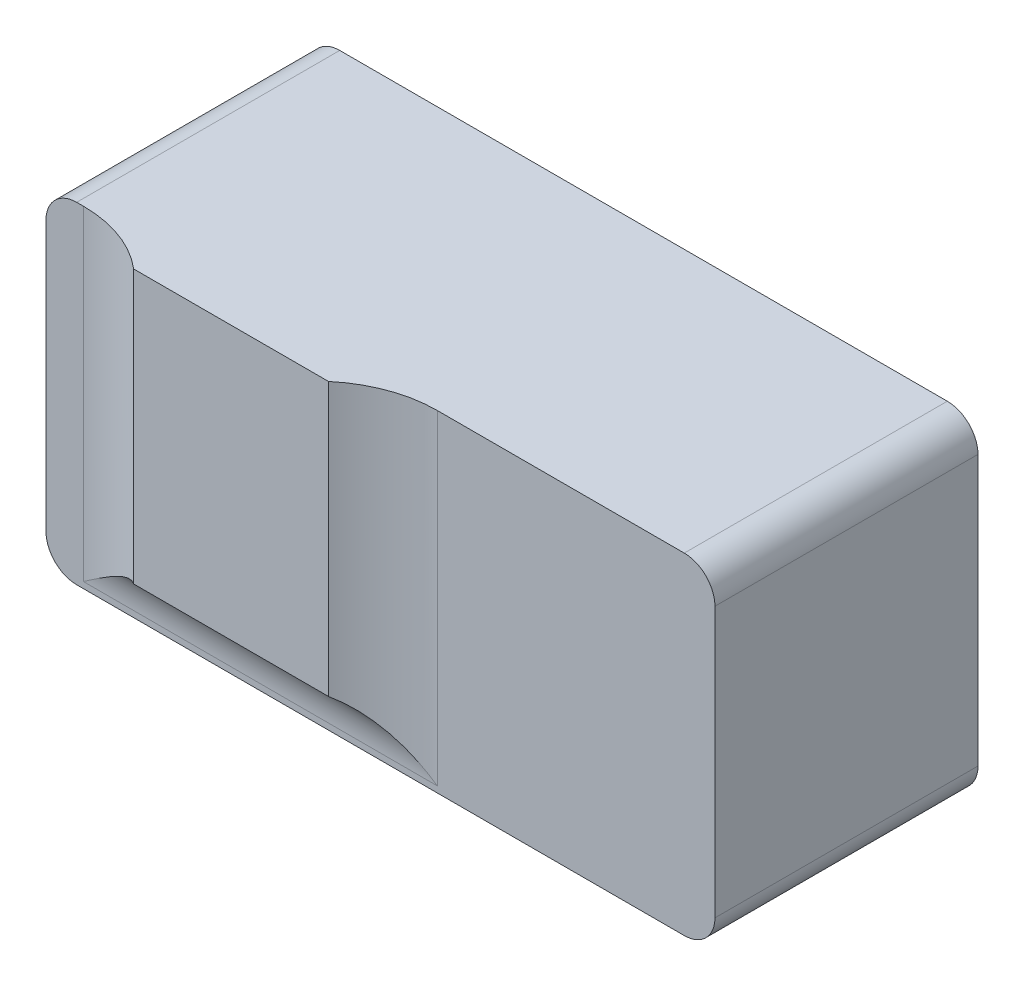
ISO-10303-21;
HEADER;
FILE_DESCRIPTION(('STEP AP214'),'2;1');
FILE_NAME('part.step','',(''),(''),'','','');
FILE_SCHEMA(('AUTOMOTIVE_DESIGN { 1 0 10303 214 1 1 1 1 }'));
ENDSEC;
DATA;
#1=APPLICATION_CONTEXT('core data for automotive mechanical design processes');
#2=APPLICATION_PROTOCOL_DEFINITION('international standard','automotive_design',2000,#1);
#3=PRODUCT_CONTEXT('',#1,'mechanical');
#4=PRODUCT('Part','Part','',(#3));
#5=PRODUCT_RELATED_PRODUCT_CATEGORY('part','',(#4));
#6=PRODUCT_DEFINITION_FORMATION('','',#4);
#7=PRODUCT_DEFINITION_CONTEXT('part definition',#1,'design');
#8=PRODUCT_DEFINITION('design','',#6,#7);
#9=PRODUCT_DEFINITION_SHAPE('','',#8);
#10=(LENGTH_UNIT() NAMED_UNIT(*) SI_UNIT(.MILLI.,.METRE.));
#11=(NAMED_UNIT(*) PLANE_ANGLE_UNIT() SI_UNIT($,.RADIAN.));
#12=(NAMED_UNIT(*) SI_UNIT($,.STERADIAN.) SOLID_ANGLE_UNIT());
#13=UNCERTAINTY_MEASURE_WITH_UNIT(LENGTH_MEASURE(1.E-05),#10,'distance_accuracy_value','');
#14=(GEOMETRIC_REPRESENTATION_CONTEXT(3) GLOBAL_UNCERTAINTY_ASSIGNED_CONTEXT((#13)) GLOBAL_UNIT_ASSIGNED_CONTEXT((#10,
#11,#12)) REPRESENTATION_CONTEXT('',''));
#15=CARTESIAN_POINT('',(0.,0.,0.));
#16=DIRECTION('',(0.,0.,1.));
#17=DIRECTION('',(1.,0.,0.));
#18=AXIS2_PLACEMENT_3D('',#15,#16,#17);
#19=CARTESIAN_POINT('',(109.,53.975,42.8625));
#20=DIRECTION('',(0.,0.,-1.));
#21=DIRECTION('',(-1.,0.,0.));
#22=AXIS2_PLACEMENT_3D('',#19,#20,#21);
#23=PLANE('',#22);
#24=DIRECTION('',(-1.,0.,0.));
#25=VECTOR('',#24,1.);
#26=CARTESIAN_POINT('',(-109.,53.975,42.8625));
#27=LINE('',#26,#25);
#28=CARTESIAN_POINT('',(-96.8089632173887,53.975,42.8625));
#29=VERTEX_POINT('',#28);
#30=CARTESIAN_POINT('',(-99.,53.975,42.8625));
#31=VERTEX_POINT('',#30);
#32=EDGE_CURVE('E164',#29,#31,#27,.T.);
#33=ORIENTED_EDGE('',*,*,#32,.T.);
#34=CARTESIAN_POINT('',(-99.,43.975,42.8625));
#35=DIRECTION('',(0.,0.,-1.));
#36=DIRECTION('',(-1.,0.,0.));
#37=AXIS2_PLACEMENT_3D('',#34,#35,#36);
#38=CIRCLE('',#37,10.);
#39=CARTESIAN_POINT('',(-109.,43.975,42.8625));
#40=VERTEX_POINT('',#39);
#41=EDGE_CURVE('E189',#31,#40,#38,.F.);
#42=ORIENTED_EDGE('',*,*,#41,.T.);
#43=DIRECTION('',(0.,-1.,0.));
#44=VECTOR('',#43,1.);
#45=CARTESIAN_POINT('',(-109.,-53.975,42.8625));
#46=LINE('',#45,#44);
#47=CARTESIAN_POINT('',(-109.,-43.975,42.8625));
#48=VERTEX_POINT('',#47);
#49=EDGE_CURVE('E161',#40,#48,#46,.T.);
#50=ORIENTED_EDGE('',*,*,#49,.T.);
#51=CARTESIAN_POINT('',(-99.,-43.975,42.8625));
#52=DIRECTION('',(0.,0.,-1.));
#53=DIRECTION('',(-1.,0.,0.));
#54=AXIS2_PLACEMENT_3D('',#51,#52,#53);
#55=CIRCLE('',#54,10.);
#56=CARTESIAN_POINT('',(-99.,-53.975,42.8625));
#57=VERTEX_POINT('',#56);
#58=EDGE_CURVE('E187',#48,#57,#55,.F.);
#59=ORIENTED_EDGE('',*,*,#58,.T.);
#60=DIRECTION('',(1.,0.,0.));
#61=VECTOR('',#60,1.);
#62=CARTESIAN_POINT('',(-109.,-53.975,42.8625));
#63=LINE('',#62,#61);
#64=CARTESIAN_POINT('',(99.,-53.975,42.8625));
#65=VERTEX_POINT('',#64);
#66=EDGE_CURVE('E158',#57,#65,#63,.T.);
#67=ORIENTED_EDGE('',*,*,#66,.T.);
#68=CARTESIAN_POINT('',(99.,-43.975,42.8625));
#69=DIRECTION('',(0.,0.,-1.));
#70=DIRECTION('',(-1.,0.,0.));
#71=AXIS2_PLACEMENT_3D('',#68,#69,#70);
#72=CIRCLE('',#71,10.);
#73=CARTESIAN_POINT('',(109.,-43.975,42.8625));
#74=VERTEX_POINT('',#73);
#75=EDGE_CURVE('E58',#65,#74,#72,.F.);
#76=ORIENTED_EDGE('',*,*,#75,.T.);
#77=DIRECTION('',(0.,1.,0.));
#78=VECTOR('',#77,1.);
#79=CARTESIAN_POINT('',(109.,-53.975,42.8625));
#80=LINE('',#79,#78);
#81=CARTESIAN_POINT('',(109.,43.975,42.8625));
#82=VERTEX_POINT('',#81);
#83=EDGE_CURVE('E162',#74,#82,#80,.T.);
#84=ORIENTED_EDGE('',*,*,#83,.T.);
#85=CARTESIAN_POINT('',(99.,43.975,42.8625));
#86=DIRECTION('',(0.,0.,-1.));
#87=DIRECTION('',(-1.,0.,0.));
#88=AXIS2_PLACEMENT_3D('',#85,#86,#87);
#89=CIRCLE('',#88,10.);
#90=CARTESIAN_POINT('',(99.,53.975,42.8625));
#91=VERTEX_POINT('',#90);
#92=EDGE_CURVE('E185',#82,#91,#89,.F.);
#93=ORIENTED_EDGE('',*,*,#92,.T.);
#94=CARTESIAN_POINT('',(18.5089632173887,53.975,42.8625));
#95=VERTEX_POINT('',#94);
#96=EDGE_CURVE('E174',#91,#95,#27,.T.);
#97=ORIENTED_EDGE('',*,*,#96,.T.);
#98=DIRECTION('',(0.,1.,0.));
#99=VECTOR('',#98,1.);
#100=CARTESIAN_POINT('',(18.5089632173887,53.975,42.8625));
#101=LINE('',#100,#99);
#102=CARTESIAN_POINT('',(18.5089632173887,-51.9624403887438,42.8625));
#103=VERTEX_POINT('',#102);
#104=EDGE_CURVE('E160',#95,#103,#101,.F.);
#105=ORIENTED_EDGE('',*,*,#104,.T.);
#106=DIRECTION('',(1.,0.,0.));
#107=VECTOR('',#106,1.);
#108=CARTESIAN_POINT('',(109.,-51.9624403887438,42.8625));
#109=LINE('',#108,#107);
#110=CARTESIAN_POINT('',(-96.8089632173886,-51.9624403887438,42.8625));
#111=VERTEX_POINT('',#110);
#112=EDGE_CURVE('E419',#103,#111,#109,.F.);
#113=ORIENTED_EDGE('',*,*,#112,.T.);
#114=DIRECTION('',(0.,-1.,0.));
#115=VECTOR('',#114,1.);
#116=CARTESIAN_POINT('',(-96.8089632173887,53.9749999999999,42.8625));
#117=LINE('',#116,#115);
#118=EDGE_CURVE('E132',#111,#29,#117,.F.);
#119=ORIENTED_EDGE('',*,*,#118,.T.);
#120=EDGE_LOOP('',(#33,#42,#50,#59,#67,#76,#84,#93,#97,#105,#113,#119));
#121=FACE_BOUND('',#120,.T.);
#122=ADVANCED_FACE('F38',(#121),#23,.F.);
#123=CARTESIAN_POINT('',(109.,-53.975,42.8625));
#124=DIRECTION('',(-1.,0.,0.));
#125=DIRECTION('',(0.,0.,1.));
#126=AXIS2_PLACEMENT_3D('',#123,#124,#125);
#127=PLANE('',#126);
#128=DIRECTION('',(0.,1.,0.));
#129=VECTOR('',#128,1.);
#130=CARTESIAN_POINT('',(109.,-53.975,-42.8625));
#131=LINE('',#130,#129);
#132=CARTESIAN_POINT('',(109.,-43.975,-42.8625));
#133=VERTEX_POINT('',#132);
#134=CARTESIAN_POINT('',(109.,43.975,-42.8625));
#135=VERTEX_POINT('',#134);
#136=EDGE_CURVE('E157',#133,#135,#131,.T.);
#137=ORIENTED_EDGE('',*,*,#136,.T.);
#138=DIRECTION('',(0.,0.,-1.));
#139=VECTOR('',#138,1.);
#140=CARTESIAN_POINT('',(109.,43.975,42.8625));
#141=LINE('',#140,#139);
#142=EDGE_CURVE('E11',#135,#82,#141,.F.);
#143=ORIENTED_EDGE('',*,*,#142,.T.);
#144=ORIENTED_EDGE('',*,*,#83,.F.);
#145=DIRECTION('',(0.,0.,-1.));
#146=VECTOR('',#145,1.);
#147=CARTESIAN_POINT('',(109.,-43.975,42.8625));
#148=LINE('',#147,#146);
#149=EDGE_CURVE('E46',#74,#133,#148,.T.);
#150=ORIENTED_EDGE('',*,*,#149,.T.);
#151=EDGE_LOOP('',(#137,#143,#144,#150));
#152=FACE_BOUND('',#151,.T.);
#153=ADVANCED_FACE('F198',(#152),#127,.F.);
#154=CARTESIAN_POINT('',(-109.,53.975,42.8625));
#155=DIRECTION('',(0.,-1.,0.));
#156=DIRECTION('',(0.,0.,-1.));
#157=AXIS2_PLACEMENT_3D('',#154,#155,#156);
#158=PLANE('',#157);
#159=DIRECTION('',(-1.,0.,0.));
#160=VECTOR('',#159,1.);
#161=CARTESIAN_POINT('',(-109.,53.975,-42.8625));
#162=LINE('',#161,#160);
#163=CARTESIAN_POINT('',(99.,53.975,-42.8625));
#164=VERTEX_POINT('',#163);
#165=CARTESIAN_POINT('',(-99.,53.975,-42.8625));
#166=VERTEX_POINT('',#165);
#167=EDGE_CURVE('E208',#164,#166,#162,.T.);
#168=ORIENTED_EDGE('',*,*,#167,.T.);
#169=DIRECTION('',(0.,0.,-1.));
#170=VECTOR('',#169,1.);
#171=CARTESIAN_POINT('',(-99.,53.975,42.8625));
#172=LINE('',#171,#170);
#173=EDGE_CURVE('E182',#166,#31,#172,.F.);
#174=ORIENTED_EDGE('',*,*,#173,.T.);
#175=ORIENTED_EDGE('',*,*,#32,.F.);
#176=CARTESIAN_POINT('',(-96.8089632173887,53.975,82.8625));
#177=DIRECTION('',(0.,-1.,0.));
#178=DIRECTION('',(0.,0.,-1.));
#179=AXIS2_PLACEMENT_3D('',#176,#177,#178);
#180=CIRCLE('',#179,40.);
#181=CARTESIAN_POINT('',(-70.9,53.975,52.3875));
#182=VERTEX_POINT('',#181);
#183=EDGE_CURVE('E420',#29,#182,#180,.T.);
#184=ORIENTED_EDGE('',*,*,#183,.T.);
#185=DIRECTION('',(-1.,0.,0.));
#186=VECTOR('',#185,1.);
#187=CARTESIAN_POINT('',(-70.9,53.975,52.3875));
#188=LINE('',#187,#186);
#189=CARTESIAN_POINT('',(-7.39999999999996,53.975,52.3875));
#190=VERTEX_POINT('',#189);
#191=EDGE_CURVE('E148',#190,#182,#188,.T.);
#192=ORIENTED_EDGE('',*,*,#191,.F.);
#193=CARTESIAN_POINT('',(18.5089632173887,53.975,82.8625));
#194=DIRECTION('',(0.,-1.,0.));
#195=DIRECTION('',(0.,0.,-1.));
#196=AXIS2_PLACEMENT_3D('',#193,#194,#195);
#197=CIRCLE('',#196,40.);
#198=EDGE_CURVE('E417',#190,#95,#197,.T.);
#199=ORIENTED_EDGE('',*,*,#198,.T.);
#200=ORIENTED_EDGE('',*,*,#96,.F.);
#201=DIRECTION('',(0.,0.,-1.));
#202=VECTOR('',#201,1.);
#203=CARTESIAN_POINT('',(99.,53.975,42.8625));
#204=LINE('',#203,#202);
#205=EDGE_CURVE('E179',#91,#164,#204,.T.);
#206=ORIENTED_EDGE('',*,*,#205,.T.);
#207=EDGE_LOOP('',(#168,#174,#175,#184,#192,#199,#200,#206));
#208=FACE_BOUND('',#207,.T.);
#209=ADVANCED_FACE('F232',(#208),#158,.F.);
#210=CARTESIAN_POINT('',(-109.,-53.975,42.8625));
#211=DIRECTION('',(1.,0.,0.));
#212=DIRECTION('',(0.,0.,-1.));
#213=AXIS2_PLACEMENT_3D('',#210,#211,#212);
#214=PLANE('',#213);
#215=ORIENTED_EDGE('',*,*,#49,.F.);
#216=DIRECTION('',(0.,0.,-1.));
#217=VECTOR('',#216,1.);
#218=CARTESIAN_POINT('',(-109.,43.975,42.8625));
#219=LINE('',#218,#217);
#220=CARTESIAN_POINT('',(-109.,43.975,-42.8625));
#221=VERTEX_POINT('',#220);
#222=EDGE_CURVE('E222',#40,#221,#219,.T.);
#223=ORIENTED_EDGE('',*,*,#222,.T.);
#224=DIRECTION('',(0.,-1.,0.));
#225=VECTOR('',#224,1.);
#226=CARTESIAN_POINT('',(-109.,-53.975,-42.8625));
#227=LINE('',#226,#225);
#228=CARTESIAN_POINT('',(-109.,-43.975,-42.8625));
#229=VERTEX_POINT('',#228);
#230=EDGE_CURVE('E211',#221,#229,#227,.T.);
#231=ORIENTED_EDGE('',*,*,#230,.T.);
#232=DIRECTION('',(0.,0.,-1.));
#233=VECTOR('',#232,1.);
#234=CARTESIAN_POINT('',(-109.,-43.975,42.8625));
#235=LINE('',#234,#233);
#236=EDGE_CURVE('E137',#229,#48,#235,.F.);
#237=ORIENTED_EDGE('',*,*,#236,.T.);
#238=EDGE_LOOP('',(#215,#223,#231,#237));
#239=FACE_BOUND('',#238,.T.);
#240=ADVANCED_FACE('F242',(#239),#214,.F.);
#241=CARTESIAN_POINT('',(-109.,-53.975,42.8625));
#242=DIRECTION('',(0.,1.,0.));
#243=DIRECTION('',(0.,0.,1.));
#244=AXIS2_PLACEMENT_3D('',#241,#242,#243);
#245=PLANE('',#244);
#246=ORIENTED_EDGE('',*,*,#66,.F.);
#247=DIRECTION('',(0.,0.,-1.));
#248=VECTOR('',#247,1.);
#249=CARTESIAN_POINT('',(-99.,-53.975,42.8625));
#250=LINE('',#249,#248);
#251=CARTESIAN_POINT('',(-99.,-53.975,-42.8625));
#252=VERTEX_POINT('',#251);
#253=EDGE_CURVE('E193',#57,#252,#250,.T.);
#254=ORIENTED_EDGE('',*,*,#253,.T.);
#255=DIRECTION('',(1.,0.,0.));
#256=VECTOR('',#255,1.);
#257=CARTESIAN_POINT('',(-109.,-53.975,-42.8625));
#258=LINE('',#257,#256);
#259=CARTESIAN_POINT('',(99.,-53.975,-42.8625));
#260=VERTEX_POINT('',#259);
#261=EDGE_CURVE('E165',#252,#260,#258,.T.);
#262=ORIENTED_EDGE('',*,*,#261,.T.);
#263=DIRECTION('',(0.,0.,-1.));
#264=VECTOR('',#263,1.);
#265=CARTESIAN_POINT('',(99.,-53.975,42.8625));
#266=LINE('',#265,#264);
#267=EDGE_CURVE('E191',#260,#65,#266,.F.);
#268=ORIENTED_EDGE('',*,*,#267,.T.);
#269=EDGE_LOOP('',(#246,#254,#262,#268));
#270=FACE_BOUND('',#269,.T.);
#271=ADVANCED_FACE('F220',(#270),#245,.F.);
#272=CARTESIAN_POINT('',(109.,53.975,-42.8625));
#273=DIRECTION('',(0.,0.,-1.));
#274=DIRECTION('',(-1.,0.,0.));
#275=AXIS2_PLACEMENT_3D('',#272,#273,#274);
#276=PLANE('',#275);
#277=ORIENTED_EDGE('',*,*,#230,.F.);
#278=CARTESIAN_POINT('',(-99.,43.975,-42.8625));
#279=DIRECTION('',(0.,0.,-1.));
#280=DIRECTION('',(-1.,0.,0.));
#281=AXIS2_PLACEMENT_3D('',#278,#279,#280);
#282=CIRCLE('',#281,10.);
#283=EDGE_CURVE('E177',#221,#166,#282,.T.);
#284=ORIENTED_EDGE('',*,*,#283,.T.);
#285=ORIENTED_EDGE('',*,*,#167,.F.);
#286=CARTESIAN_POINT('',(99.,43.975,-42.8625));
#287=DIRECTION('',(0.,0.,-1.));
#288=DIRECTION('',(-1.,0.,0.));
#289=AXIS2_PLACEMENT_3D('',#286,#287,#288);
#290=CIRCLE('',#289,10.);
#291=EDGE_CURVE('E207',#164,#135,#290,.T.);
#292=ORIENTED_EDGE('',*,*,#291,.T.);
#293=ORIENTED_EDGE('',*,*,#136,.F.);
#294=CARTESIAN_POINT('',(99.,-43.975,-42.8625));
#295=DIRECTION('',(0.,0.,-1.));
#296=DIRECTION('',(-1.,0.,0.));
#297=AXIS2_PLACEMENT_3D('',#294,#295,#296);
#298=CIRCLE('',#297,10.);
#299=EDGE_CURVE('E204',#133,#260,#298,.T.);
#300=ORIENTED_EDGE('',*,*,#299,.T.);
#301=ORIENTED_EDGE('',*,*,#261,.F.);
#302=CARTESIAN_POINT('',(-99.,-43.975,-42.8625));
#303=DIRECTION('',(0.,0.,-1.));
#304=DIRECTION('',(-1.,0.,0.));
#305=AXIS2_PLACEMENT_3D('',#302,#303,#304);
#306=CIRCLE('',#305,10.);
#307=EDGE_CURVE('E224',#252,#229,#306,.T.);
#308=ORIENTED_EDGE('',*,*,#307,.T.);
#309=EDGE_LOOP('',(#277,#284,#285,#292,#293,#300,#301,#308));
#310=FACE_BOUND('',#309,.T.);
#311=ADVANCED_FACE('F202',(#310),#276,.T.);
#312=CARTESIAN_POINT('',(-70.8999999999999,-34.925,52.3875));
#313=DIRECTION('',(0.,0.,1.));
#314=DIRECTION('',(1.,0.,0.));
#315=AXIS2_PLACEMENT_3D('',#312,#313,#314);
#316=PLANE('',#315);
#317=DIRECTION('',(0.,-1.,0.));
#318=VECTOR('',#317,1.);
#319=CARTESIAN_POINT('',(-70.9,53.975,52.3875));
#320=LINE('',#319,#318);
#321=CARTESIAN_POINT('',(-70.8999999999999,-34.925,52.3875));
#322=VERTEX_POINT('',#321);
#323=EDGE_CURVE('E131',#182,#322,#320,.T.);
#324=ORIENTED_EDGE('',*,*,#323,.T.);
#325=DIRECTION('',(1.,0.,0.));
#326=VECTOR('',#325,1.);
#327=CARTESIAN_POINT('',(-70.8999999999999,-34.925,52.3875));
#328=LINE('',#327,#326);
#329=CARTESIAN_POINT('',(-7.39999999999995,-34.925,52.3875));
#330=VERTEX_POINT('',#329);
#331=EDGE_CURVE('E145',#322,#330,#328,.T.);
#332=ORIENTED_EDGE('',*,*,#331,.T.);
#333=DIRECTION('',(0.,1.,0.));
#334=VECTOR('',#333,1.);
#335=CARTESIAN_POINT('',(-7.39999999999996,53.975,52.3875));
#336=LINE('',#335,#334);
#337=EDGE_CURVE('E152',#330,#190,#336,.T.);
#338=ORIENTED_EDGE('',*,*,#337,.T.);
#339=ORIENTED_EDGE('',*,*,#191,.T.);
#340=EDGE_LOOP('',(#324,#332,#338,#339));
#341=FACE_BOUND('',#340,.T.);
#342=ADVANCED_FACE('F143',(#341),#316,.T.);
#343=CARTESIAN_POINT('',(-96.8089632173887,53.975,82.8625));
#344=DIRECTION('',(0.,-1.,0.));
#345=DIRECTION('',(1.,0.,0.));
#346=AXIS2_PLACEMENT_3D('',#343,#344,#345);
#347=CYLINDRICAL_SURFACE('',#346,40.);
#348=ORIENTED_EDGE('',*,*,#183,.F.);
#349=ORIENTED_EDGE('',*,*,#118,.F.);
#350=CARTESIAN_POINT('',(-70.8999999999999,-34.925,52.3875));
#351=CARTESIAN_POINT('',(-71.3104190204857,-35.1395494107261,52.0385781209957));
#352=CARTESIAN_POINT('',(-71.725307686261,-35.362380617523,51.7001303331622));
#353=CARTESIAN_POINT('',(-72.5629921827944,-35.822916176055,51.0440158866423));
#354=CARTESIAN_POINT('',(-72.9857859418337,-36.0606166682049,50.7263438786679));
#355=CARTESIAN_POINT('',(-73.8378000388088,-36.5489337732248,50.1119109250377));
#356=CARTESIAN_POINT('',(-74.2670093856585,-36.7995297701057,49.8151182940649));
#357=CARTESIAN_POINT('',(-75.1317051311937,-37.3125660630809,49.2415886622132));
#358=CARTESIAN_POINT('',(-75.5671919865123,-37.5750072237953,48.9648531292267));
#359=CARTESIAN_POINT('',(-76.8799157748109,-38.3768811026,48.1655080440661));
#360=CARTESIAN_POINT('',(-77.7655488401454,-38.9320957702964,47.6722306040746));
#361=CARTESIAN_POINT('',(-79.5544782856213,-40.0759469993795,46.761377863796));
#362=CARTESIAN_POINT('',(-80.4577841641989,-40.6646018761501,46.3438445843024));
#363=CARTESIAN_POINT('',(-81.9943001498222,-41.6804851361714,45.7008676351007));
#364=CARTESIAN_POINT('',(-82.6240162358812,-42.1008940603844,45.4560973769197));
#365=CARTESIAN_POINT('',(-83.8887621962117,-42.9520540645687,45.0006427005731));
#366=CARTESIAN_POINT('',(-84.523792467499,-43.382805921823,44.7899608534546));
#367=CARTESIAN_POINT('',(-86.4357915192022,-44.6880739208344,44.2079664231364));
#368=CARTESIAN_POINT('',(-87.7196010295619,-45.5755575928768,43.8867329728376));
#369=CARTESIAN_POINT('',(-89.6524622417585,-46.9220957622924,43.5024240045175));
#370=CARTESIAN_POINT('',(-90.2977895385576,-47.3733871806976,43.3905925612469));
#371=CARTESIAN_POINT('',(-91.5904373609067,-48.2799052787488,43.1989909123152));
#372=CARTESIAN_POINT('',(-92.2377579164177,-48.7351320177348,43.119221190971));
#373=CARTESIAN_POINT('',(-94.1808438056819,-50.1040997576733,42.9277252491111));
#374=CARTESIAN_POINT('',(-95.4789472608241,-51.0219772537449,42.8635724123368));
#375=CARTESIAN_POINT('',(-96.7871900280339,-51.947044419375,42.8625044461474));
#376=CARTESIAN_POINT('',(-96.7980766501669,-51.9547424237389,42.8625000017763));
#377=CARTESIAN_POINT('',(-96.8089632173886,-51.9624403887438,42.8625));
#378=B_SPLINE_CURVE_WITH_KNOTS('',3,(#350,#351,#352,#353,#354,#355,#356,#357,#358,#359,#360,
#361,#362,#363,#364,#365,#366,#367,#368,#369,#370,#371,#372,#373,#374,#375,#376,#377),
.UNSPECIFIED.,.F.,.F.,(4,2,2,2,2,2,2,2,2,2,2,2,2,4),(0.,1.73925725704252,3.47806491758986,
5.21417425180211,6.95041051632146,10.414211348732,13.8799279656225,16.2663219770333,
18.6528958934085,23.4263001971577,25.8118928426718,28.1975215230449,32.964288945624,
33.0042889478478),.UNSPECIFIED.);
#379=EDGE_CURVE('E127',#111,#322,#378,.F.);
#380=ORIENTED_EDGE('',*,*,#379,.T.);
#381=ORIENTED_EDGE('',*,*,#323,.F.);
#382=EDGE_LOOP('',(#348,#349,#380,#381));
#383=FACE_BOUND('',#382,.T.);
#384=ADVANCED_FACE('F130',(#383),#347,.F.);
#385=CARTESIAN_POINT('',(18.5089632173887,53.975,82.8625));
#386=DIRECTION('',(0.,1.,0.));
#387=DIRECTION('',(-1.,0.,0.));
#388=AXIS2_PLACEMENT_3D('',#385,#386,#387);
#389=CYLINDRICAL_SURFACE('',#388,40.);
#390=ORIENTED_EDGE('',*,*,#337,.F.);
#391=CARTESIAN_POINT('',(-7.39999999999995,-34.925,52.3875));
#392=CARTESIAN_POINT('',(-6.98958097951418,-35.1395494107261,52.0385781209958));
#393=CARTESIAN_POINT('',(-6.57469231373894,-35.362380617523,51.7001303331622));
#394=CARTESIAN_POINT('',(-5.73700781720556,-35.8229161760549,51.0440158866424));
#395=CARTESIAN_POINT('',(-5.31421405816634,-36.0606166682049,50.726343878668));
#396=CARTESIAN_POINT('',(-4.4621999611912,-36.5489337732247,50.1119109250378));
#397=CARTESIAN_POINT('',(-4.0329906143415,-36.7995297701056,49.815118294065));
#398=CARTESIAN_POINT('',(-3.16829486880635,-37.3125660630808,49.2415886622133));
#399=CARTESIAN_POINT('',(-2.73280801348778,-37.5750072237952,48.9648531292268));
#400=CARTESIAN_POINT('',(-1.42008422518914,-38.3768811025998,48.1655080440662));
#401=CARTESIAN_POINT('',(-0.534451159854609,-38.9320957702963,47.6722306040747));
#402=CARTESIAN_POINT('',(1.25447828562137,-40.0759469993795,46.7613778637961));
#403=CARTESIAN_POINT('',(2.15778416419895,-40.6646018761501,46.3438445843024));
#404=CARTESIAN_POINT('',(3.69430014982228,-41.6804851361714,45.7008676351007));
#405=CARTESIAN_POINT('',(4.32401623588136,-42.1008940603844,45.4560973769197));
#406=CARTESIAN_POINT('',(5.58876219621183,-42.9520540645687,45.0006427005731));
#407=CARTESIAN_POINT('',(6.22379246749909,-43.382805921823,44.7899608534546));
#408=CARTESIAN_POINT('',(8.13579151920228,-44.6880739208344,44.2079664231364));
#409=CARTESIAN_POINT('',(9.419601029562,-45.5755575928769,43.8867329728375));
#410=CARTESIAN_POINT('',(11.3524622417586,-46.9220957622924,43.5024240045175));
#411=CARTESIAN_POINT('',(11.9977895385577,-47.3733871806976,43.3905925612469));
#412=CARTESIAN_POINT('',(13.2904373609068,-48.2799052787489,43.1989909123152));
#413=CARTESIAN_POINT('',(13.9377579164177,-48.735132017735,43.119221190971));
#414=CARTESIAN_POINT('',(15.8808438056824,-50.1040997576727,42.9277252491111));
#415=CARTESIAN_POINT('',(17.1789472608263,-51.021977253742,42.8635724123368));
#416=CARTESIAN_POINT('',(18.4871900280341,-51.9470444193749,42.8625044461474));
#417=CARTESIAN_POINT('',(18.498076650167,-51.9547424237388,42.8625000017763));
#418=CARTESIAN_POINT('',(18.5089632173887,-51.9624403887438,42.8625));
#419=B_SPLINE_CURVE_WITH_KNOTS('',3,(#391,#392,#393,#394,#395,#396,#397,#398,#399,#400,#401,
#402,#403,#404,#405,#406,#407,#408,#409,#410,#411,#412,#413,#414,#415,#416,#417,#418),
.UNSPECIFIED.,.F.,.F.,(4,2,2,2,2,2,2,2,2,2,2,2,2,4),(0.,1.73925725704245,3.47806491758971,
5.21417425180191,6.95041051632119,10.4142113487319,13.8799279656225,16.2663219770333,
18.6528958934085,23.4263001971577,25.8118928426718,28.197521523045,32.964288945624,
33.0042889478478),.UNSPECIFIED.);
#420=EDGE_CURVE('E138',#330,#103,#419,.T.);
#421=ORIENTED_EDGE('',*,*,#420,.T.);
#422=ORIENTED_EDGE('',*,*,#104,.F.);
#423=ORIENTED_EDGE('',*,*,#198,.F.);
#424=EDGE_LOOP('',(#390,#421,#422,#423));
#425=FACE_BOUND('',#424,.T.);
#426=ADVANCED_FACE('F260',(#425),#389,.F.);
#427=CARTESIAN_POINT('',(-70.8999999999999,-51.9624403887438,62.8625));
#428=DIRECTION('',(1.,0.,0.));
#429=DIRECTION('',(0.,0.,-1.));
#430=AXIS2_PLACEMENT_3D('',#427,#428,#429);
#431=CYLINDRICAL_SURFACE('',#430,20.);
#432=ORIENTED_EDGE('',*,*,#379,.F.);
#433=ORIENTED_EDGE('',*,*,#112,.F.);
#434=ORIENTED_EDGE('',*,*,#420,.F.);
#435=ORIENTED_EDGE('',*,*,#331,.F.);
#436=EDGE_LOOP('',(#432,#433,#434,#435));
#437=FACE_BOUND('',#436,.T.);
#438=ADVANCED_FACE('F150',(#437),#431,.F.);
#439=CARTESIAN_POINT('',(-99.,43.975,42.8625));
#440=DIRECTION('',(0.,0.,-1.));
#441=DIRECTION('',(-1.,0.,0.));
#442=AXIS2_PLACEMENT_3D('',#439,#440,#441);
#443=CYLINDRICAL_SURFACE('',#442,10.);
#444=ORIENTED_EDGE('',*,*,#41,.F.);
#445=ORIENTED_EDGE('',*,*,#173,.F.);
#446=ORIENTED_EDGE('',*,*,#283,.F.);
#447=ORIENTED_EDGE('',*,*,#222,.F.);
#448=EDGE_LOOP('',(#444,#445,#446,#447));
#449=FACE_BOUND('',#448,.T.);
#450=ADVANCED_FACE('F238',(#449),#443,.T.);
#451=CARTESIAN_POINT('',(-99.,-43.975,42.8625));
#452=DIRECTION('',(0.,0.,-1.));
#453=DIRECTION('',(-1.,0.,0.));
#454=AXIS2_PLACEMENT_3D('',#451,#452,#453);
#455=CYLINDRICAL_SURFACE('',#454,10.);
#456=ORIENTED_EDGE('',*,*,#58,.F.);
#457=ORIENTED_EDGE('',*,*,#236,.F.);
#458=ORIENTED_EDGE('',*,*,#307,.F.);
#459=ORIENTED_EDGE('',*,*,#253,.F.);
#460=EDGE_LOOP('',(#456,#457,#458,#459));
#461=FACE_BOUND('',#460,.T.);
#462=ADVANCED_FACE('F322',(#461),#455,.T.);
#463=CARTESIAN_POINT('',(99.,43.975,42.8625));
#464=DIRECTION('',(0.,0.,-1.));
#465=DIRECTION('',(-1.,0.,0.));
#466=AXIS2_PLACEMENT_3D('',#463,#464,#465);
#467=CYLINDRICAL_SURFACE('',#466,10.);
#468=ORIENTED_EDGE('',*,*,#92,.F.);
#469=ORIENTED_EDGE('',*,*,#142,.F.);
#470=ORIENTED_EDGE('',*,*,#291,.F.);
#471=ORIENTED_EDGE('',*,*,#205,.F.);
#472=EDGE_LOOP('',(#468,#469,#470,#471));
#473=FACE_BOUND('',#472,.T.);
#474=ADVANCED_FACE('F329',(#473),#467,.T.);
#475=CARTESIAN_POINT('',(99.,-43.975,42.8625));
#476=DIRECTION('',(0.,0.,-1.));
#477=DIRECTION('',(-1.,0.,0.));
#478=AXIS2_PLACEMENT_3D('',#475,#476,#477);
#479=CYLINDRICAL_SURFACE('',#478,10.);
#480=ORIENTED_EDGE('',*,*,#75,.F.);
#481=ORIENTED_EDGE('',*,*,#267,.F.);
#482=ORIENTED_EDGE('',*,*,#299,.F.);
#483=ORIENTED_EDGE('',*,*,#149,.F.);
#484=EDGE_LOOP('',(#480,#481,#482,#483));
#485=FACE_BOUND('',#484,.T.);
#486=ADVANCED_FACE('F40',(#485),#479,.T.);
#487=CLOSED_SHELL('',(#122,#153,#209,#240,#271,#311,#342,#384,#426,#438,#450,#462,#474,#486));
#488=MANIFOLD_SOLID_BREP('B2',#487);
#489=ADVANCED_BREP_SHAPE_REPRESENTATION('',(#18,#488),#14);
#490=SHAPE_DEFINITION_REPRESENTATION(#9,#489);
ENDSEC;
END-ISO-10303-21;
